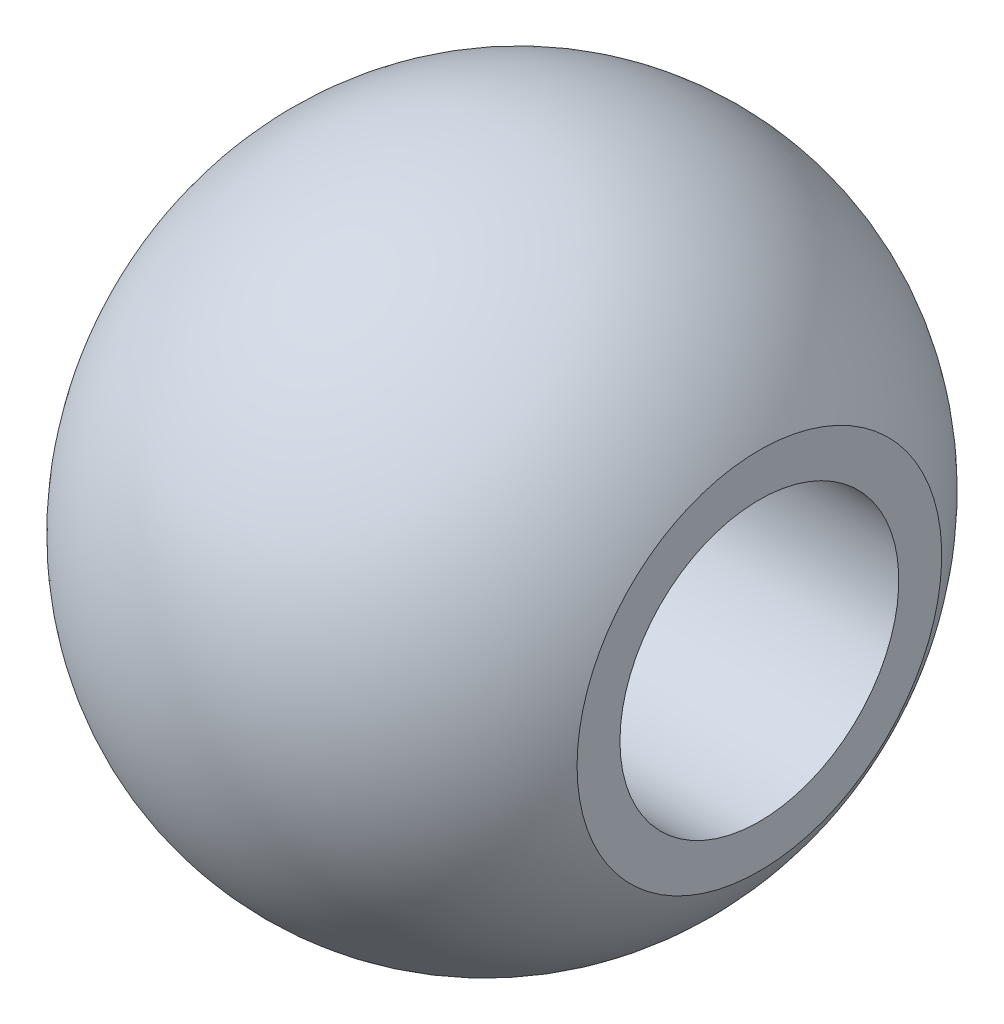
ISO-10303-21;
HEADER;
FILE_DESCRIPTION(('STEP AP214'),'2;1');
FILE_NAME('part.step','',(''),(''),'','','');
FILE_SCHEMA(('AUTOMOTIVE_DESIGN { 1 0 10303 214 1 1 1 1 }'));
ENDSEC;
DATA;
#1=APPLICATION_CONTEXT('core data for automotive mechanical design processes');
#2=APPLICATION_PROTOCOL_DEFINITION('international standard','automotive_design',2000,#1);
#3=PRODUCT_CONTEXT('',#1,'mechanical');
#4=PRODUCT('Part','Part','',(#3));
#5=PRODUCT_RELATED_PRODUCT_CATEGORY('part','',(#4));
#6=PRODUCT_DEFINITION_FORMATION('','',#4);
#7=PRODUCT_DEFINITION_CONTEXT('part definition',#1,'design');
#8=PRODUCT_DEFINITION('design','',#6,#7);
#9=PRODUCT_DEFINITION_SHAPE('','',#8);
#10=(LENGTH_UNIT() NAMED_UNIT(*) SI_UNIT(.MILLI.,.METRE.));
#11=(NAMED_UNIT(*) PLANE_ANGLE_UNIT() SI_UNIT($,.RADIAN.));
#12=(NAMED_UNIT(*) SI_UNIT($,.STERADIAN.) SOLID_ANGLE_UNIT());
#13=UNCERTAINTY_MEASURE_WITH_UNIT(LENGTH_MEASURE(1.E-05),#10,'distance_accuracy_value','');
#14=(GEOMETRIC_REPRESENTATION_CONTEXT(3) GLOBAL_UNCERTAINTY_ASSIGNED_CONTEXT((#13)) GLOBAL_UNIT_ASSIGNED_CONTEXT((#10,
#11,#12)) REPRESENTATION_CONTEXT('',''));
#15=CARTESIAN_POINT('',(0.,0.,0.));
#16=DIRECTION('',(0.,0.,1.));
#17=DIRECTION('',(1.,0.,0.));
#18=AXIS2_PLACEMENT_3D('',#15,#16,#17);
#19=CARTESIAN_POINT('',(0.,0.,0.));
#20=DIRECTION('',(-1.,0.,0.));
#21=DIRECTION('',(0.,0.,1.));
#22=AXIS2_PLACEMENT_3D('',#19,#20,#21);
#23=DEGENERATE_TOROIDAL_SURFACE('',#22,0.877678924885442,6.8827719295108,.T.);
#24=CARTESIAN_POINT('',(-6.,0.,0.));
#25=DIRECTION('',(-1.,0.,0.));
#26=DIRECTION('',(0.,0.,1.));
#27=AXIS2_PLACEMENT_3D('',#24,#25,#26);
#28=CIRCLE('',#27,4.25);
#29=CARTESIAN_POINT('',(-6.,0.,4.25));
#30=VERTEX_POINT('',#29);
#31=EDGE_CURVE('E36',#30,#30,#28,.T.);
#32=ORIENTED_EDGE('',*,*,#31,.F.);
#33=EDGE_LOOP('',(#32));
#34=FACE_BOUND('',#33,.T.);
#35=CARTESIAN_POINT('',(6.,0.,0.));
#36=DIRECTION('',(-1.,0.,0.));
#37=DIRECTION('',(0.,0.,1.));
#38=AXIS2_PLACEMENT_3D('',#35,#36,#37);
#39=CIRCLE('',#38,4.25);
#40=CARTESIAN_POINT('',(6.,0.,4.25));
#41=VERTEX_POINT('',#40);
#42=EDGE_CURVE('E10',#41,#41,#39,.T.);
#43=ORIENTED_EDGE('',*,*,#42,.T.);
#44=EDGE_LOOP('',(#43));
#45=FACE_BOUND('',#44,.T.);
#46=ADVANCED_FACE('F30',(#34,#45),#23,.T.);
#47=CARTESIAN_POINT('',(6.,0.,0.));
#48=DIRECTION('',(-1.,0.,0.));
#49=DIRECTION('',(0.,0.,1.));
#50=AXIS2_PLACEMENT_3D('',#47,#48,#49);
#51=PLANE('',#50);
#52=CARTESIAN_POINT('',(6.,0.,0.));
#53=DIRECTION('',(-1.,0.,0.));
#54=DIRECTION('',(0.,0.,1.));
#55=AXIS2_PLACEMENT_3D('',#52,#53,#54);
#56=CIRCLE('',#55,3.25);
#57=CARTESIAN_POINT('',(6.,0.,3.25));
#58=VERTEX_POINT('',#57);
#59=EDGE_CURVE('E40',#58,#58,#56,.F.);
#60=ORIENTED_EDGE('',*,*,#59,.F.);
#61=EDGE_LOOP('',(#60));
#62=FACE_BOUND('',#61,.T.);
#63=ORIENTED_EDGE('',*,*,#42,.F.);
#64=EDGE_LOOP('',(#63));
#65=FACE_BOUND('',#64,.T.);
#66=ADVANCED_FACE('F54',(#62,#65),#51,.F.);
#67=CARTESIAN_POINT('',(-6.,0.,-4.25));
#68=DIRECTION('',(1.,0.,0.));
#69=DIRECTION('',(0.,0.,-1.));
#70=AXIS2_PLACEMENT_3D('',#67,#68,#69);
#71=PLANE('',#70);
#72=CARTESIAN_POINT('',(-6.,0.,0.));
#73=DIRECTION('',(-1.,0.,0.));
#74=DIRECTION('',(0.,0.,1.));
#75=AXIS2_PLACEMENT_3D('',#72,#73,#74);
#76=CIRCLE('',#75,3.25);
#77=CARTESIAN_POINT('',(-6.,0.,3.25));
#78=VERTEX_POINT('',#77);
#79=EDGE_CURVE('E44',#78,#78,#76,.T.);
#80=ORIENTED_EDGE('',*,*,#79,.F.);
#81=EDGE_LOOP('',(#80));
#82=FACE_BOUND('',#81,.T.);
#83=ORIENTED_EDGE('',*,*,#31,.T.);
#84=EDGE_LOOP('',(#83));
#85=FACE_BOUND('',#84,.T.);
#86=ADVANCED_FACE('F52',(#82,#85),#71,.F.);
#87=CARTESIAN_POINT('',(15.1923881554251,0.,0.));
#88=DIRECTION('',(-1.,0.,0.));
#89=DIRECTION('',(0.,0.,1.));
#90=AXIS2_PLACEMENT_3D('',#87,#88,#89);
#91=CYLINDRICAL_SURFACE('',#90,3.25);
#92=ORIENTED_EDGE('',*,*,#59,.T.);
#93=EDGE_LOOP('',(#92));
#94=FACE_BOUND('',#93,.T.);
#95=ORIENTED_EDGE('',*,*,#79,.T.);
#96=EDGE_LOOP('',(#95));
#97=FACE_BOUND('',#96,.T.);
#98=ADVANCED_FACE('F50',(#94,#97),#91,.F.);
#99=CLOSED_SHELL('',(#46,#66,#86,#98));
#100=MANIFOLD_SOLID_BREP('B2',#99);
#101=ADVANCED_BREP_SHAPE_REPRESENTATION('',(#18,#100),#14);
#102=SHAPE_DEFINITION_REPRESENTATION(#9,#101);
ENDSEC;
END-ISO-10303-21;
